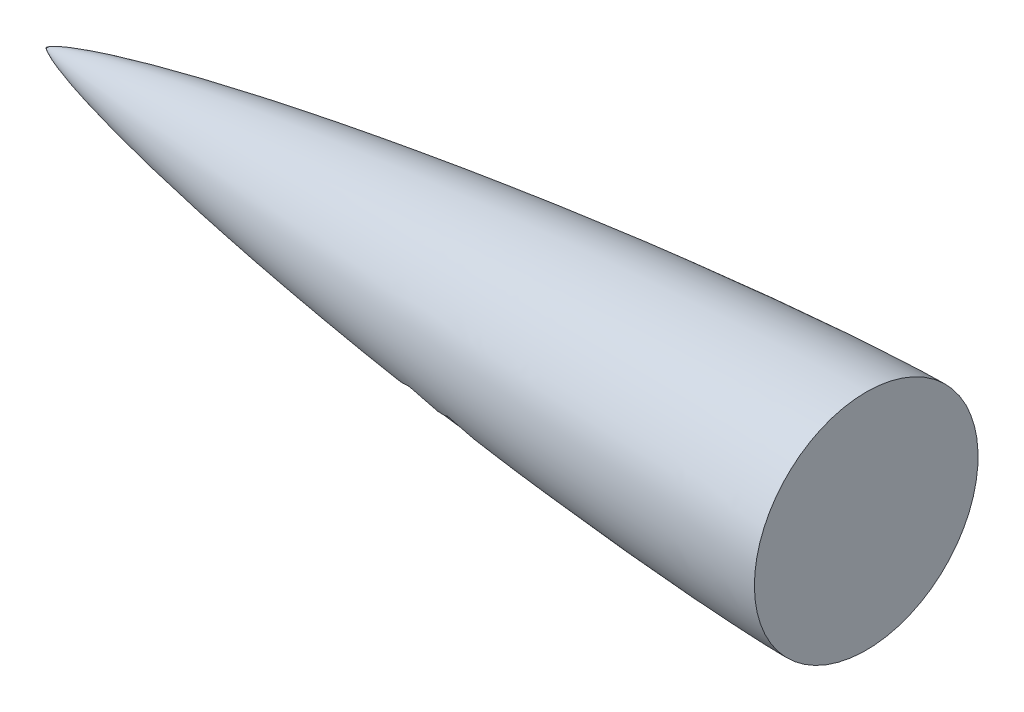
ISO-10303-21;
HEADER;
FILE_DESCRIPTION(('STEP AP214'),'2;1');
FILE_NAME('part.step','',(''),(''),'','','');
FILE_SCHEMA(('AUTOMOTIVE_DESIGN { 1 0 10303 214 1 1 1 1 }'));
ENDSEC;
DATA;
#1=APPLICATION_CONTEXT('core data for automotive mechanical design processes');
#2=APPLICATION_PROTOCOL_DEFINITION('international standard','automotive_design',2000,#1);
#3=PRODUCT_CONTEXT('',#1,'mechanical');
#4=PRODUCT('Part','Part','',(#3));
#5=PRODUCT_RELATED_PRODUCT_CATEGORY('part','',(#4));
#6=PRODUCT_DEFINITION_FORMATION('','',#4);
#7=PRODUCT_DEFINITION_CONTEXT('part definition',#1,'design');
#8=PRODUCT_DEFINITION('design','',#6,#7);
#9=PRODUCT_DEFINITION_SHAPE('','',#8);
#10=(LENGTH_UNIT() NAMED_UNIT(*) SI_UNIT(.MILLI.,.METRE.));
#11=(NAMED_UNIT(*) PLANE_ANGLE_UNIT() SI_UNIT($,.RADIAN.));
#12=(NAMED_UNIT(*) SI_UNIT($,.STERADIAN.) SOLID_ANGLE_UNIT());
#13=UNCERTAINTY_MEASURE_WITH_UNIT(LENGTH_MEASURE(1.E-05),#10,'distance_accuracy_value','');
#14=(GEOMETRIC_REPRESENTATION_CONTEXT(3) GLOBAL_UNCERTAINTY_ASSIGNED_CONTEXT((#13)) GLOBAL_UNIT_ASSIGNED_CONTEXT((#10,
#11,#12)) REPRESENTATION_CONTEXT('',''));
#15=CARTESIAN_POINT('',(0.,0.,0.));
#16=DIRECTION('',(0.,0.,1.));
#17=DIRECTION('',(1.,0.,0.));
#18=AXIS2_PLACEMENT_3D('',#15,#16,#17);
#19=CARTESIAN_POINT('',(22.,0.,0.));
#20=DIRECTION('',(-1.,0.,0.));
#21=DIRECTION('',(0.,0.,1.));
#22=AXIS2_PLACEMENT_3D('',#19,#20,#21);
#23=PLANE('',#22);
#24=CARTESIAN_POINT('',(22.,0.,0.));
#25=DIRECTION('',(-1.,0.,0.));
#26=DIRECTION('',(0.,0.,1.));
#27=AXIS2_PLACEMENT_3D('',#24,#25,#26);
#28=CIRCLE('',#27,3.);
#29=CARTESIAN_POINT('',(22.,0.,3.));
#30=VERTEX_POINT('',#29);
#31=EDGE_CURVE('E11',#30,#30,#28,.T.);
#32=ORIENTED_EDGE('',*,*,#31,.F.);
#33=EDGE_LOOP('',(#32));
#34=FACE_BOUND('',#33,.T.);
#35=ADVANCED_FACE('F39',(#34),#23,.F.);
#36=CARTESIAN_POINT('',(0.,0.,0.));
#37=CARTESIAN_POINT('',(0.00179854547936862,0.00344529578066377,0.));
#38=CARTESIAN_POINT('',(0.00605680848122507,0.00914643835811047,0.));
#39=CARTESIAN_POINT('',(0.0141924329115769,0.0159815231996095,0.));
#40=CARTESIAN_POINT('',(0.0261484754892025,0.0252838702680459,0.));
#41=CARTESIAN_POINT('',(0.0414439913591393,0.035551733171273,0.));
#42=CARTESIAN_POINT('',(0.0648870487366255,0.0498458579142335,0.));
#43=CARTESIAN_POINT('',(0.104547333385133,0.071333169139784,0.));
#44=CARTESIAN_POINT('',(0.173882110795494,0.10455298853827,0.));
#45=CARTESIAN_POINT('',(0.299619218124399,0.157330328498444,0.));
#46=CARTESIAN_POINT('',(0.526300182756852,0.239817570891544,0.));
#47=CARTESIAN_POINT('',(0.901842414218112,0.357899227323827,0.));
#48=CARTESIAN_POINT('',(1.57841132758706,0.542669502441978,0.));
#49=CARTESIAN_POINT('',(2.53422057276714,0.766107401588637,0.));
#50=CARTESIAN_POINT('',(3.72037522903569,1.00978137986741,0.));
#51=CARTESIAN_POINT('',(5.08197545193991,1.25906281760298,0.));
#52=CARTESIAN_POINT('',(6.44977928985452,1.48690265888544,0.));
#53=CARTESIAN_POINT('',(7.82047659136926,1.69662469340036,0.));
#54=CARTESIAN_POINT('',(9.19346306428481,1.89069429076187,0.));
#55=CARTESIAN_POINT('',(10.5683911928586,2.0704938256106,0.));
#56=CARTESIAN_POINT('',(11.9449961736588,2.23693640190103,0.));
#57=CARTESIAN_POINT('',(13.323108762651,2.39039005560544,0.));
#58=CARTESIAN_POINT('',(14.7025982575437,2.53095010481419,0.));
#59=CARTESIAN_POINT('',(16.0833792049019,2.65817830068507,0.));
#60=CARTESIAN_POINT('',(17.4653911195178,2.77137653867475,0.));
#61=CARTESIAN_POINT('',(18.8486021647447,2.86880045870204,0.));
#62=CARTESIAN_POINT('',(20.1550935566218,2.94361589384877,0.));
#63=CARTESIAN_POINT('',(21.1162618913486,2.98279200918618,0.));
#64=CARTESIAN_POINT('',(21.7313817949215,2.99827338530292,0.));
#65=CARTESIAN_POINT('',(22.,3.,0.));
#66=B_SPLINE_CURVE_WITH_KNOTS('',4,(#36,#37,#38,#39,#40,#41,#42,#43,#44,#45,#46,#47,#48,#49,#50,
#51,#52,#53,#54,#55,#56,#57,#58,#59,#60,#61,#62,#63,#64,#65),.UNSPECIFIED.,.F.,.F.,(5,1,1,1,1,1,
1,1,1,1,1,1,1,1,1,1,1,1,1,1,1,1,1,1,1,1,5),(0.,0.000695889739785475,0.00128540998568148,
0.00187924809115524,0.00273300070221762,0.00399605827660522,0.00621853322920549,
0.00997401997041098,0.0165361397705078,0.0284748305826257,0.0495243062759542,0.0806511371446664,
0.142462052032761,0.204715746799,0.266969441442123,0.329223138955058,0.391476837731188,
0.453730536418988,0.51598423407287,0.578237930831733,0.640491630609922,0.702745327334916,
0.764999026992656,0.827252724003826,0.889506423193524,0.951760121804561,1.),.UNSPECIFIED.);
#67=CARTESIAN_POINT('',(0.,0.,0.));
#68=DIRECTION('',(-1.,0.,0.));
#69=AXIS1_PLACEMENT('',#67,#68);
#70=SURFACE_OF_REVOLUTION('',#66,#69);
#71=ORIENTED_EDGE('',*,*,#31,.T.);
#72=EDGE_LOOP('',(#71));
#73=FACE_BOUND('',#72,.T.);
#74=CARTESIAN_POINT('',(0.,0.,0.));
#75=VERTEX_POINT('',#74);
#76=VERTEX_LOOP('',#75);
#77=FACE_BOUND('',#76,.T.);
#78=ADVANCED_FACE('F48',(#73,#77),#70,.F.);
#79=CLOSED_SHELL('',(#35,#78));
#80=MANIFOLD_SOLID_BREP('B2',#79);
#81=ADVANCED_BREP_SHAPE_REPRESENTATION('',(#18,#80),#14);
#82=SHAPE_DEFINITION_REPRESENTATION(#9,#81);
ENDSEC;
END-ISO-10303-21;
